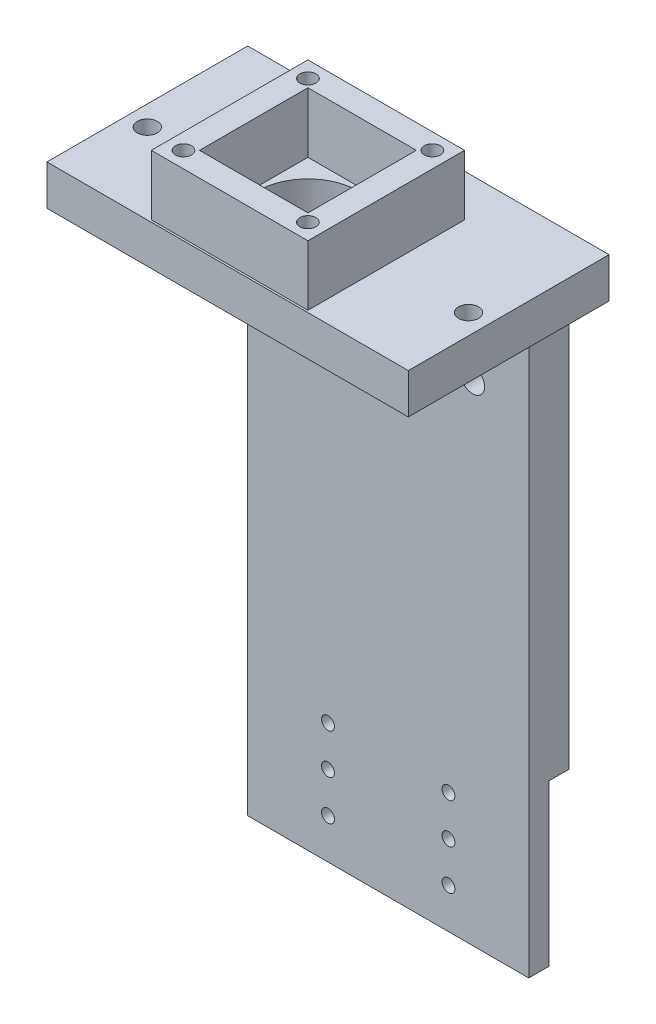
ISO-10303-21;
HEADER;
FILE_DESCRIPTION(('STEP AP214'),'2;1');
FILE_NAME('part.step','',(''),(''),'','','');
FILE_SCHEMA(('AUTOMOTIVE_DESIGN { 1 0 10303 214 1 1 1 1 }'));
ENDSEC;
DATA;
#1=APPLICATION_CONTEXT('core data for automotive mechanical design processes');
#2=APPLICATION_PROTOCOL_DEFINITION('international standard','automotive_design',2000,#1);
#3=PRODUCT_CONTEXT('',#1,'mechanical');
#4=PRODUCT('Part','Part','',(#3));
#5=PRODUCT_RELATED_PRODUCT_CATEGORY('part','',(#4));
#6=PRODUCT_DEFINITION_FORMATION('','',#4);
#7=PRODUCT_DEFINITION_CONTEXT('part definition',#1,'design');
#8=PRODUCT_DEFINITION('design','',#6,#7);
#9=PRODUCT_DEFINITION_SHAPE('','',#8);
#10=(LENGTH_UNIT() NAMED_UNIT(*) SI_UNIT(.MILLI.,.METRE.));
#11=(NAMED_UNIT(*) PLANE_ANGLE_UNIT() SI_UNIT($,.RADIAN.));
#12=(NAMED_UNIT(*) SI_UNIT($,.STERADIAN.) SOLID_ANGLE_UNIT());
#13=UNCERTAINTY_MEASURE_WITH_UNIT(LENGTH_MEASURE(1.E-05),#10,'distance_accuracy_value','');
#14=(GEOMETRIC_REPRESENTATION_CONTEXT(3) GLOBAL_UNCERTAINTY_ASSIGNED_CONTEXT((#13)) GLOBAL_UNIT_ASSIGNED_CONTEXT((#10,
#11,#12)) REPRESENTATION_CONTEXT('',''));
#15=CARTESIAN_POINT('',(0.,0.,0.));
#16=DIRECTION('',(0.,0.,1.));
#17=DIRECTION('',(1.,0.,0.));
#18=AXIS2_PLACEMENT_3D('',#15,#16,#17);
#19=CARTESIAN_POINT('',(47.8741031645975,130.,27.7151189199662));
#20=DIRECTION('',(0.,0.,1.));
#21=DIRECTION('',(0.,-1.,0.));
#22=AXIS2_PLACEMENT_3D('',#19,#20,#21);
#23=PLANE('',#22);
#24=CARTESIAN_POINT('',(17.8641031645975,110.,27.7151189199662));
#25=DIRECTION('',(0.,0.,1.));
#26=DIRECTION('',(0.,-1.,0.));
#27=AXIS2_PLACEMENT_3D('',#24,#25,#26);
#28=CIRCLE('',#27,1.60000000000001);
#29=CARTESIAN_POINT('',(17.8641031645975,108.4,27.7151189199662));
#30=VERTEX_POINT('',#29);
#31=EDGE_CURVE('E356',#30,#30,#28,.F.);
#32=ORIENTED_EDGE('',*,*,#31,.F.);
#33=EDGE_LOOP('',(#32));
#34=FACE_BOUND('',#33,.T.);
#35=CARTESIAN_POINT('',(-12.1358968354025,120.,27.7151189199662));
#36=DIRECTION('',(0.,0.,1.));
#37=DIRECTION('',(0.,-1.,0.));
#38=AXIS2_PLACEMENT_3D('',#35,#36,#37);
#39=CIRCLE('',#38,1.6);
#40=CARTESIAN_POINT('',(-12.1358968354025,118.4,27.7151189199662));
#41=VERTEX_POINT('',#40);
#42=EDGE_CURVE('E350',#41,#41,#39,.F.);
#43=ORIENTED_EDGE('',*,*,#42,.F.);
#44=EDGE_LOOP('',(#43));
#45=FACE_BOUND('',#44,.T.);
#46=CARTESIAN_POINT('',(-12.1358968354025,100.,27.7151189199662));
#47=DIRECTION('',(0.,0.,1.));
#48=DIRECTION('',(0.,-1.,0.));
#49=AXIS2_PLACEMENT_3D('',#46,#47,#48);
#50=CIRCLE('',#49,1.6);
#51=CARTESIAN_POINT('',(-12.1358968354025,98.4,27.7151189199662));
#52=VERTEX_POINT('',#51);
#53=EDGE_CURVE('E335',#52,#52,#50,.F.);
#54=ORIENTED_EDGE('',*,*,#53,.F.);
#55=EDGE_LOOP('',(#54));
#56=FACE_BOUND('',#55,.T.);
#57=CARTESIAN_POINT('',(-12.1358968354025,110.,27.7151189199662));
#58=DIRECTION('',(0.,0.,1.));
#59=DIRECTION('',(0.,-1.,0.));
#60=AXIS2_PLACEMENT_3D('',#57,#58,#59);
#61=CIRCLE('',#60,1.6);
#62=CARTESIAN_POINT('',(-12.1358968354025,108.4,27.7151189199662));
#63=VERTEX_POINT('',#62);
#64=EDGE_CURVE('E338',#63,#63,#61,.F.);
#65=ORIENTED_EDGE('',*,*,#64,.F.);
#66=EDGE_LOOP('',(#65));
#67=FACE_BOUND('',#66,.T.);
#68=CARTESIAN_POINT('',(17.8641031645975,120.,27.7151189199662));
#69=DIRECTION('',(0.,0.,1.));
#70=DIRECTION('',(0.,-1.,0.));
#71=AXIS2_PLACEMENT_3D('',#68,#69,#70);
#72=CIRCLE('',#71,1.60000000000001);
#73=CARTESIAN_POINT('',(17.8641031645975,118.4,27.7151189199662));
#74=VERTEX_POINT('',#73);
#75=EDGE_CURVE('E353',#74,#74,#72,.F.);
#76=ORIENTED_EDGE('',*,*,#75,.F.);
#77=EDGE_LOOP('',(#76));
#78=FACE_BOUND('',#77,.T.);
#79=CARTESIAN_POINT('',(17.8641031645975,100.,27.7151189199662));
#80=DIRECTION('',(0.,0.,1.));
#81=DIRECTION('',(0.,-1.,0.));
#82=AXIS2_PLACEMENT_3D('',#79,#80,#81);
#83=CIRCLE('',#82,1.60000000000001);
#84=CARTESIAN_POINT('',(17.8641031645975,98.4,27.7151189199662));
#85=VERTEX_POINT('',#84);
#86=EDGE_CURVE('E342',#85,#85,#83,.F.);
#87=ORIENTED_EDGE('',*,*,#86,.F.);
#88=EDGE_LOOP('',(#87));
#89=FACE_BOUND('',#88,.T.);
#90=DIRECTION('',(-1.,0.,0.));
#91=VECTOR('',#90,1.);
#92=CARTESIAN_POINT('',(47.8741031645975,130.,27.7151189199662));
#93=LINE('',#92,#91);
#94=CARTESIAN_POINT('',(37.8641031645975,130.,27.7151189199662));
#95=VERTEX_POINT('',#94);
#96=CARTESIAN_POINT('',(-32.1358968354025,130.,27.7151189199662));
#97=VERTEX_POINT('',#96);
#98=EDGE_CURVE('E47',#95,#97,#93,.T.);
#99=ORIENTED_EDGE('',*,*,#98,.F.);
#100=DIRECTION('',(0.,1.,0.));
#101=VECTOR('',#100,1.);
#102=CARTESIAN_POINT('',(37.8641031645975,236.,27.7151189199662));
#103=LINE('',#102,#101);
#104=CARTESIAN_POINT('',(37.8641031645975,90.,27.7151189199662));
#105=VERTEX_POINT('',#104);
#106=EDGE_CURVE('E54',#105,#95,#103,.T.);
#107=ORIENTED_EDGE('',*,*,#106,.F.);
#108=DIRECTION('',(-1.,0.,0.));
#109=VECTOR('',#108,1.);
#110=CARTESIAN_POINT('',(47.8741031645975,90.,27.7151189199662));
#111=LINE('',#110,#109);
#112=CARTESIAN_POINT('',(-32.1358968354025,90.,27.7151189199662));
#113=VERTEX_POINT('',#112);
#114=EDGE_CURVE('E11',#105,#113,#111,.T.);
#115=ORIENTED_EDGE('',*,*,#114,.T.);
#116=DIRECTION('',(0.,-1.,0.));
#117=VECTOR('',#116,1.);
#118=CARTESIAN_POINT('',(-32.1358968354025,236.,27.7151189199662));
#119=LINE('',#118,#117);
#120=EDGE_CURVE('E363',#97,#113,#119,.T.);
#121=ORIENTED_EDGE('',*,*,#120,.F.);
#122=EDGE_LOOP('',(#99,#107,#115,#121));
#123=FACE_BOUND('',#122,.T.);
#124=ADVANCED_FACE('F38',(#34,#45,#56,#67,#78,#89,#123),#23,.F.);
#125=CARTESIAN_POINT('',(47.8741031645975,90.,27.7151189199662));
#126=DIRECTION('',(0.,1.,0.));
#127=DIRECTION('',(0.,0.,1.));
#128=AXIS2_PLACEMENT_3D('',#125,#126,#127);
#129=PLANE('',#128);
#130=ORIENTED_EDGE('',*,*,#114,.F.);
#131=DIRECTION('',(0.,0.,-1.));
#132=VECTOR('',#131,1.);
#133=CARTESIAN_POINT('',(37.8641031645975,90.,32.7151189199662));
#134=LINE('',#133,#132);
#135=CARTESIAN_POINT('',(37.8641031645975,90.,32.7151189199662));
#136=VERTEX_POINT('',#135);
#137=EDGE_CURVE('E344',#136,#105,#134,.T.);
#138=ORIENTED_EDGE('',*,*,#137,.F.);
#139=DIRECTION('',(1.,0.,0.));
#140=VECTOR('',#139,1.);
#141=CARTESIAN_POINT('',(-32.1358968354025,90.,32.7151189199662));
#142=LINE('',#141,#140);
#143=CARTESIAN_POINT('',(-32.1358968354025,90.,32.7151189199662));
#144=VERTEX_POINT('',#143);
#145=EDGE_CURVE('E339',#144,#136,#142,.T.);
#146=ORIENTED_EDGE('',*,*,#145,.F.);
#147=DIRECTION('',(0.,0.,1.));
#148=VECTOR('',#147,1.);
#149=CARTESIAN_POINT('',(-32.1358968354025,90.,22.7151189199662));
#150=LINE('',#149,#148);
#151=EDGE_CURVE('E365',#113,#144,#150,.T.);
#152=ORIENTED_EDGE('',*,*,#151,.F.);
#153=EDGE_LOOP('',(#130,#138,#146,#152));
#154=FACE_BOUND('',#153,.T.);
#155=ADVANCED_FACE('F386',(#154),#129,.F.);
#156=CARTESIAN_POINT('',(47.8741031645975,130.,22.7151189199662));
#157=DIRECTION('',(0.,1.,0.));
#158=DIRECTION('',(0.,0.,1.));
#159=AXIS2_PLACEMENT_3D('',#156,#157,#158);
#160=PLANE('',#159);
#161=DIRECTION('',(-1.,0.,0.));
#162=VECTOR('',#161,1.);
#163=CARTESIAN_POINT('',(37.8641031645975,130.,22.7151189199662));
#164=LINE('',#163,#162);
#165=CARTESIAN_POINT('',(37.8641031645975,130.,22.7151189199662));
#166=VERTEX_POINT('',#165);
#167=CARTESIAN_POINT('',(-32.1358968354025,130.,22.7151189199662));
#168=VERTEX_POINT('',#167);
#169=EDGE_CURVE('E341',#166,#168,#164,.T.);
#170=ORIENTED_EDGE('',*,*,#169,.F.);
#171=DIRECTION('',(0.,0.,-1.));
#172=VECTOR('',#171,1.);
#173=CARTESIAN_POINT('',(37.8641031645975,130.,32.7151189199662));
#174=LINE('',#173,#172);
#175=EDGE_CURVE('E362',#95,#166,#174,.T.);
#176=ORIENTED_EDGE('',*,*,#175,.F.);
#177=ORIENTED_EDGE('',*,*,#98,.T.);
#178=DIRECTION('',(0.,0.,1.));
#179=VECTOR('',#178,1.);
#180=CARTESIAN_POINT('',(-32.1358968354025,130.,22.7151189199662));
#181=LINE('',#180,#179);
#182=EDGE_CURVE('E42',#168,#97,#181,.T.);
#183=ORIENTED_EDGE('',*,*,#182,.F.);
#184=EDGE_LOOP('',(#170,#176,#177,#183));
#185=FACE_BOUND('',#184,.T.);
#186=ADVANCED_FACE('F40',(#185),#160,.F.);
#187=CARTESIAN_POINT('',(16.3641031645975,261.,33.2151189199662));
#188=DIRECTION('',(-1.,0.,0.));
#189=DIRECTION('',(0.,0.,1.));
#190=AXIS2_PLACEMENT_3D('',#187,#188,#189);
#191=PLANE('',#190);
#192=DIRECTION('',(0.,0.,-1.));
#193=VECTOR('',#192,1.);
#194=CARTESIAN_POINT('',(16.3641031645975,246.,33.2151189199662));
#195=LINE('',#194,#193);
#196=CARTESIAN_POINT('',(16.3641031645975,246.,66.2151189199662));
#197=VERTEX_POINT('',#196);
#198=CARTESIAN_POINT('',(16.3641031645975,246.,39.2151189199662));
#199=VERTEX_POINT('',#198);
#200=EDGE_CURVE('E257',#197,#199,#195,.T.);
#201=ORIENTED_EDGE('',*,*,#200,.F.);
#202=DIRECTION('',(0.,-1.,0.));
#203=VECTOR('',#202,1.);
#204=CARTESIAN_POINT('',(16.3641031645975,261.,66.2151189199662));
#205=LINE('',#204,#203);
#206=CARTESIAN_POINT('',(16.3641031645975,261.,66.2151189199662));
#207=VERTEX_POINT('',#206);
#208=EDGE_CURVE('E265',#207,#197,#205,.T.);
#209=ORIENTED_EDGE('',*,*,#208,.F.);
#210=DIRECTION('',(0.,0.,-1.));
#211=VECTOR('',#210,1.);
#212=CARTESIAN_POINT('',(16.3641031645975,261.,33.2151189199662));
#213=LINE('',#212,#211);
#214=CARTESIAN_POINT('',(16.3641031645975,261.,39.2151189199662));
#215=VERTEX_POINT('',#214);
#216=EDGE_CURVE('E246',#207,#215,#213,.T.);
#217=ORIENTED_EDGE('',*,*,#216,.T.);
#218=DIRECTION('',(0.,-1.,0.));
#219=VECTOR('',#218,1.);
#220=CARTESIAN_POINT('',(16.3641031645975,261.,39.2151189199662));
#221=LINE('',#220,#219);
#222=EDGE_CURVE('E263',#215,#199,#221,.T.);
#223=ORIENTED_EDGE('',*,*,#222,.T.);
#224=EDGE_LOOP('',(#201,#209,#217,#223));
#225=FACE_BOUND('',#224,.T.);
#226=ADVANCED_FACE('F483',(#225),#191,.T.);
#227=CARTESIAN_POINT('',(-16.6358968354025,261.,39.2151189199662));
#228=DIRECTION('',(0.,0.,1.));
#229=DIRECTION('',(1.,0.,0.));
#230=AXIS2_PLACEMENT_3D('',#227,#228,#229);
#231=PLANE('',#230);
#232=DIRECTION('',(-1.,0.,0.));
#233=VECTOR('',#232,1.);
#234=CARTESIAN_POINT('',(-16.6358968354025,246.,39.2151189199662));
#235=LINE('',#234,#233);
#236=CARTESIAN_POINT('',(-10.6358968354025,246.,39.2151189199662));
#237=VERTEX_POINT('',#236);
#238=EDGE_CURVE('E244',#199,#237,#235,.T.);
#239=ORIENTED_EDGE('',*,*,#238,.F.);
#240=ORIENTED_EDGE('',*,*,#222,.F.);
#241=DIRECTION('',(-1.,0.,0.));
#242=VECTOR('',#241,1.);
#243=CARTESIAN_POINT('',(-16.6358968354025,261.,39.2151189199662));
#244=LINE('',#243,#242);
#245=CARTESIAN_POINT('',(-10.6358968354025,261.,39.2151189199662));
#246=VERTEX_POINT('',#245);
#247=EDGE_CURVE('E249',#215,#246,#244,.T.);
#248=ORIENTED_EDGE('',*,*,#247,.T.);
#249=DIRECTION('',(0.,-1.,0.));
#250=VECTOR('',#249,1.);
#251=CARTESIAN_POINT('',(-10.6358968354025,261.,39.2151189199662));
#252=LINE('',#251,#250);
#253=EDGE_CURVE('E251',#246,#237,#252,.T.);
#254=ORIENTED_EDGE('',*,*,#253,.T.);
#255=EDGE_LOOP('',(#239,#240,#248,#254));
#256=FACE_BOUND('',#255,.T.);
#257=ADVANCED_FACE('F472',(#256),#231,.T.);
#258=CARTESIAN_POINT('',(-10.6358968354025,261.,33.2151189199662));
#259=DIRECTION('',(1.,0.,0.));
#260=DIRECTION('',(0.,0.,-1.));
#261=AXIS2_PLACEMENT_3D('',#258,#259,#260);
#262=PLANE('',#261);
#263=DIRECTION('',(0.,0.,1.));
#264=VECTOR('',#263,1.);
#265=CARTESIAN_POINT('',(-10.6358968354025,246.,33.2151189199662));
#266=LINE('',#265,#264);
#267=CARTESIAN_POINT('',(-10.6358968354025,246.,66.2151189199662));
#268=VERTEX_POINT('',#267);
#269=EDGE_CURVE('E238',#237,#268,#266,.T.);
#270=ORIENTED_EDGE('',*,*,#269,.F.);
#271=ORIENTED_EDGE('',*,*,#253,.F.);
#272=DIRECTION('',(0.,0.,1.));
#273=VECTOR('',#272,1.);
#274=CARTESIAN_POINT('',(-10.6358968354025,261.,33.2151189199662));
#275=LINE('',#274,#273);
#276=CARTESIAN_POINT('',(-10.6358968354025,261.,66.2151189199662));
#277=VERTEX_POINT('',#276);
#278=EDGE_CURVE('E241',#246,#277,#275,.T.);
#279=ORIENTED_EDGE('',*,*,#278,.T.);
#280=DIRECTION('',(0.,-1.,0.));
#281=VECTOR('',#280,1.);
#282=CARTESIAN_POINT('',(-10.6358968354025,261.,66.2151189199662));
#283=LINE('',#282,#281);
#284=EDGE_CURVE('E267',#277,#268,#283,.T.);
#285=ORIENTED_EDGE('',*,*,#284,.T.);
#286=EDGE_LOOP('',(#270,#271,#279,#285));
#287=FACE_BOUND('',#286,.T.);
#288=ADVANCED_FACE('F463',(#287),#262,.T.);
#289=CARTESIAN_POINT('',(-16.6358968354025,261.,66.2151189199662));
#290=DIRECTION('',(0.,0.,-1.));
#291=DIRECTION('',(-1.,0.,0.));
#292=AXIS2_PLACEMENT_3D('',#289,#290,#291);
#293=PLANE('',#292);
#294=DIRECTION('',(1.,0.,0.));
#295=VECTOR('',#294,1.);
#296=CARTESIAN_POINT('',(-16.6358968354025,246.,66.2151189199662));
#297=LINE('',#296,#295);
#298=EDGE_CURVE('E254',#268,#197,#297,.T.);
#299=ORIENTED_EDGE('',*,*,#298,.F.);
#300=ORIENTED_EDGE('',*,*,#284,.F.);
#301=DIRECTION('',(1.,0.,0.));
#302=VECTOR('',#301,1.);
#303=CARTESIAN_POINT('',(-16.6358968354025,261.,66.2151189199662));
#304=LINE('',#303,#302);
#305=EDGE_CURVE('E243',#277,#207,#304,.T.);
#306=ORIENTED_EDGE('',*,*,#305,.T.);
#307=ORIENTED_EDGE('',*,*,#208,.T.);
#308=EDGE_LOOP('',(#299,#300,#306,#307));
#309=FACE_BOUND('',#308,.T.);
#310=ADVANCED_FACE('F454',(#309),#293,.T.);
#311=CARTESIAN_POINT('',(37.8641031645975,246.,72.7151189199662));
#312=DIRECTION('',(0.,1.,0.));
#313=DIRECTION('',(0.,0.,1.));
#314=AXIS2_PLACEMENT_3D('',#311,#312,#313);
#315=PLANE('',#314);
#316=CARTESIAN_POINT('',(2.86410316459754,246.,52.7151189199662));
#317=DIRECTION('',(0.,-1.,0.));
#318=DIRECTION('',(0.,0.,-1.));
#319=AXIS2_PLACEMENT_3D('',#316,#317,#318);
#320=CIRCLE('',#319,12.5);
#321=CARTESIAN_POINT('',(2.86410316459754,246.,40.2151189199662));
#322=VERTEX_POINT('',#321);
#323=EDGE_CURVE('E178',#322,#322,#320,.T.);
#324=ORIENTED_EDGE('',*,*,#323,.T.);
#325=EDGE_LOOP('',(#324));
#326=FACE_BOUND('',#325,.T.);
#327=ORIENTED_EDGE('',*,*,#238,.T.);
#328=ORIENTED_EDGE('',*,*,#269,.T.);
#329=ORIENTED_EDGE('',*,*,#298,.T.);
#330=ORIENTED_EDGE('',*,*,#200,.T.);
#331=EDGE_LOOP('',(#327,#328,#329,#330));
#332=FACE_BOUND('',#331,.T.);
#333=ADVANCED_FACE('F442',(#326,#332),#315,.T.);
#334=CARTESIAN_POINT('',(0.,261.,0.));
#335=DIRECTION('',(0.,1.,0.));
#336=DIRECTION('',(0.,0.,1.));
#337=AXIS2_PLACEMENT_3D('',#334,#335,#336);
#338=PLANE('',#337);
#339=CARTESIAN_POINT('',(18.3641031645975,261.,37.2151189199662));
#340=DIRECTION('',(0.,1.,0.));
#341=DIRECTION('',(0.,0.,-1.));
#342=AXIS2_PLACEMENT_3D('',#339,#340,#341);
#343=CIRCLE('',#342,2.);
#344=CARTESIAN_POINT('',(18.3641031645975,261.,35.2151189199662));
#345=VERTEX_POINT('',#344);
#346=EDGE_CURVE('E223',#345,#345,#343,.T.);
#347=ORIENTED_EDGE('',*,*,#346,.F.);
#348=EDGE_LOOP('',(#347));
#349=FACE_BOUND('',#348,.T.);
#350=CARTESIAN_POINT('',(-12.6358968354025,261.,68.2151189199662));
#351=DIRECTION('',(0.,1.,0.));
#352=DIRECTION('',(0.,0.,-1.));
#353=AXIS2_PLACEMENT_3D('',#350,#351,#352);
#354=CIRCLE('',#353,2.);
#355=CARTESIAN_POINT('',(-12.6358968354025,261.,66.2151189199662));
#356=VERTEX_POINT('',#355);
#357=EDGE_CURVE('E230',#356,#356,#354,.T.);
#358=ORIENTED_EDGE('',*,*,#357,.F.);
#359=EDGE_LOOP('',(#358));
#360=FACE_BOUND('',#359,.T.);
#361=CARTESIAN_POINT('',(18.3641031645975,261.,68.2151189199662));
#362=DIRECTION('',(0.,1.,0.));
#363=DIRECTION('',(0.,0.,1.));
#364=AXIS2_PLACEMENT_3D('',#361,#362,#363);
#365=CIRCLE('',#364,2.);
#366=CARTESIAN_POINT('',(18.3641031645975,261.,70.2151189199662));
#367=VERTEX_POINT('',#366);
#368=EDGE_CURVE('E217',#367,#367,#365,.T.);
#369=ORIENTED_EDGE('',*,*,#368,.F.);
#370=EDGE_LOOP('',(#369));
#371=FACE_BOUND('',#370,.T.);
#372=CARTESIAN_POINT('',(-12.6358968354025,261.,37.2151189199662));
#373=DIRECTION('',(0.,1.,0.));
#374=DIRECTION('',(0.,0.,1.));
#375=AXIS2_PLACEMENT_3D('',#372,#373,#374);
#376=CIRCLE('',#375,2.);
#377=CARTESIAN_POINT('',(-12.6358968354025,261.,39.2151189199662));
#378=VERTEX_POINT('',#377);
#379=EDGE_CURVE('E226',#378,#378,#376,.T.);
#380=ORIENTED_EDGE('',*,*,#379,.F.);
#381=EDGE_LOOP('',(#380));
#382=FACE_BOUND('',#381,.T.);
#383=DIRECTION('',(0.,0.,1.));
#384=VECTOR('',#383,1.);
#385=CARTESIAN_POINT('',(-16.6358968354025,261.,33.2151189199662));
#386=LINE('',#385,#384);
#387=CARTESIAN_POINT('',(-16.6358968354025,261.,33.2151189199662));
#388=VERTEX_POINT('',#387);
#389=CARTESIAN_POINT('',(-16.6358968354025,261.,72.2151189199662));
#390=VERTEX_POINT('',#389);
#391=EDGE_CURVE('E271',#388,#390,#386,.T.);
#392=ORIENTED_EDGE('',*,*,#391,.T.);
#393=DIRECTION('',(1.,0.,0.));
#394=VECTOR('',#393,1.);
#395=CARTESIAN_POINT('',(-16.6358968354025,261.,72.2151189199662));
#396=LINE('',#395,#394);
#397=CARTESIAN_POINT('',(22.3641031645975,261.,72.2151189199662));
#398=VERTEX_POINT('',#397);
#399=EDGE_CURVE('E274',#390,#398,#396,.T.);
#400=ORIENTED_EDGE('',*,*,#399,.T.);
#401=DIRECTION('',(0.,0.,-1.));
#402=VECTOR('',#401,1.);
#403=CARTESIAN_POINT('',(22.3641031645975,261.,33.2151189199662));
#404=LINE('',#403,#402);
#405=CARTESIAN_POINT('',(22.3641031645975,261.,33.2151189199662));
#406=VERTEX_POINT('',#405);
#407=EDGE_CURVE('E277',#398,#406,#404,.T.);
#408=ORIENTED_EDGE('',*,*,#407,.T.);
#409=DIRECTION('',(-1.,0.,0.));
#410=VECTOR('',#409,1.);
#411=CARTESIAN_POINT('',(-16.6358968354025,261.,33.2151189199662));
#412=LINE('',#411,#410);
#413=EDGE_CURVE('E279',#406,#388,#412,.T.);
#414=ORIENTED_EDGE('',*,*,#413,.T.);
#415=EDGE_LOOP('',(#392,#400,#408,#414));
#416=FACE_BOUND('',#415,.T.);
#417=ORIENTED_EDGE('',*,*,#305,.F.);
#418=ORIENTED_EDGE('',*,*,#278,.F.);
#419=ORIENTED_EDGE('',*,*,#247,.F.);
#420=ORIENTED_EDGE('',*,*,#216,.F.);
#421=EDGE_LOOP('',(#417,#418,#419,#420));
#422=FACE_BOUND('',#421,.T.);
#423=ADVANCED_FACE('F453',(#349,#360,#371,#382,#416,#422),#338,.T.);
#424=CARTESIAN_POINT('',(-16.6358968354025,261.,72.2151189199662));
#425=DIRECTION('',(0.,0.,-1.));
#426=DIRECTION('',(-1.,0.,0.));
#427=AXIS2_PLACEMENT_3D('',#424,#425,#426);
#428=PLANE('',#427);
#429=DIRECTION('',(1.,0.,0.));
#430=VECTOR('',#429,1.);
#431=CARTESIAN_POINT('',(-16.6358968354025,246.,72.2151189199662));
#432=LINE('',#431,#430);
#433=CARTESIAN_POINT('',(-16.6358968354025,246.,72.2151189199662));
#434=VERTEX_POINT('',#433);
#435=CARTESIAN_POINT('',(22.3641031645975,246.,72.2151189199662));
#436=VERTEX_POINT('',#435);
#437=EDGE_CURVE('E284',#434,#436,#432,.T.);
#438=ORIENTED_EDGE('',*,*,#437,.T.);
#439=DIRECTION('',(0.,-1.,0.));
#440=VECTOR('',#439,1.);
#441=CARTESIAN_POINT('',(22.3641031645975,261.,72.2151189199662));
#442=LINE('',#441,#440);
#443=EDGE_CURVE('E297',#398,#436,#442,.T.);
#444=ORIENTED_EDGE('',*,*,#443,.F.);
#445=ORIENTED_EDGE('',*,*,#399,.F.);
#446=DIRECTION('',(0.,-1.,0.));
#447=VECTOR('',#446,1.);
#448=CARTESIAN_POINT('',(-16.6358968354025,261.,72.2151189199662));
#449=LINE('',#448,#447);
#450=EDGE_CURVE('E300',#390,#434,#449,.T.);
#451=ORIENTED_EDGE('',*,*,#450,.T.);
#452=EDGE_LOOP('',(#438,#444,#445,#451));
#453=FACE_BOUND('',#452,.T.);
#454=ADVANCED_FACE('F460',(#453),#428,.F.);
#455=CARTESIAN_POINT('',(22.3641031645975,261.,33.2151189199662));
#456=DIRECTION('',(-1.,0.,0.));
#457=DIRECTION('',(0.,0.,1.));
#458=AXIS2_PLACEMENT_3D('',#455,#456,#457);
#459=PLANE('',#458);
#460=DIRECTION('',(0.,0.,-1.));
#461=VECTOR('',#460,1.);
#462=CARTESIAN_POINT('',(22.3641031645975,246.,33.2151189199662));
#463=LINE('',#462,#461);
#464=CARTESIAN_POINT('',(22.3641031645975,246.,33.2151189199662));
#465=VERTEX_POINT('',#464);
#466=EDGE_CURVE('E287',#436,#465,#463,.T.);
#467=ORIENTED_EDGE('',*,*,#466,.T.);
#468=DIRECTION('',(0.,-1.,0.));
#469=VECTOR('',#468,1.);
#470=CARTESIAN_POINT('',(22.3641031645975,261.,33.2151189199662));
#471=LINE('',#470,#469);
#472=EDGE_CURVE('E294',#406,#465,#471,.T.);
#473=ORIENTED_EDGE('',*,*,#472,.F.);
#474=ORIENTED_EDGE('',*,*,#407,.F.);
#475=ORIENTED_EDGE('',*,*,#443,.T.);
#476=EDGE_LOOP('',(#467,#473,#474,#475));
#477=FACE_BOUND('',#476,.T.);
#478=ADVANCED_FACE('F497',(#477),#459,.F.);
#479=CARTESIAN_POINT('',(-16.6358968354025,261.,33.2151189199662));
#480=DIRECTION('',(0.,0.,1.));
#481=DIRECTION('',(1.,0.,0.));
#482=AXIS2_PLACEMENT_3D('',#479,#480,#481);
#483=PLANE('',#482);
#484=DIRECTION('',(-1.,0.,0.));
#485=VECTOR('',#484,1.);
#486=CARTESIAN_POINT('',(-16.6358968354025,246.,33.2151189199662));
#487=LINE('',#486,#485);
#488=CARTESIAN_POINT('',(-16.6358968354025,246.,33.2151189199662));
#489=VERTEX_POINT('',#488);
#490=EDGE_CURVE('E275',#465,#489,#487,.T.);
#491=ORIENTED_EDGE('',*,*,#490,.T.);
#492=DIRECTION('',(0.,-1.,0.));
#493=VECTOR('',#492,1.);
#494=CARTESIAN_POINT('',(-16.6358968354025,261.,33.2151189199662));
#495=LINE('',#494,#493);
#496=EDGE_CURVE('E281',#388,#489,#495,.T.);
#497=ORIENTED_EDGE('',*,*,#496,.F.);
#498=ORIENTED_EDGE('',*,*,#413,.F.);
#499=ORIENTED_EDGE('',*,*,#472,.T.);
#500=EDGE_LOOP('',(#491,#497,#498,#499));
#501=FACE_BOUND('',#500,.T.);
#502=ADVANCED_FACE('F406',(#501),#483,.F.);
#503=CARTESIAN_POINT('',(-16.6358968354025,261.,33.2151189199662));
#504=DIRECTION('',(1.,0.,0.));
#505=DIRECTION('',(0.,0.,-1.));
#506=AXIS2_PLACEMENT_3D('',#503,#504,#505);
#507=PLANE('',#506);
#508=DIRECTION('',(0.,0.,1.));
#509=VECTOR('',#508,1.);
#510=CARTESIAN_POINT('',(-16.6358968354025,246.,33.2151189199662));
#511=LINE('',#510,#509);
#512=EDGE_CURVE('E270',#489,#434,#511,.T.);
#513=ORIENTED_EDGE('',*,*,#512,.T.);
#514=ORIENTED_EDGE('',*,*,#450,.F.);
#515=ORIENTED_EDGE('',*,*,#391,.F.);
#516=ORIENTED_EDGE('',*,*,#496,.T.);
#517=EDGE_LOOP('',(#513,#514,#515,#516));
#518=FACE_BOUND('',#517,.T.);
#519=ADVANCED_FACE('F397',(#518),#507,.F.);
#520=CARTESIAN_POINT('',(0.,0.,72.7151189199662));
#521=DIRECTION('',(0.,0.,1.));
#522=DIRECTION('',(1.,0.,0.));
#523=AXIS2_PLACEMENT_3D('',#520,#521,#522);
#524=PLANE('',#523);
#525=DIRECTION('',(-1.,0.,0.));
#526=VECTOR('',#525,1.);
#527=CARTESIAN_POINT('',(-32.1358968354025,236.,72.7151189199662));
#528=LINE('',#527,#526);
#529=CARTESIAN_POINT('',(47.8641031645975,236.,72.7151189199662));
#530=VERTEX_POINT('',#529);
#531=CARTESIAN_POINT('',(-42.1358968354025,236.,72.7151189199662));
#532=VERTEX_POINT('',#531);
#533=EDGE_CURVE('E177',#530,#532,#528,.T.);
#534=ORIENTED_EDGE('',*,*,#533,.F.);
#535=DIRECTION('',(0.,1.,0.));
#536=VECTOR('',#535,1.);
#537=CARTESIAN_POINT('',(47.8641031645975,246.,72.7151189199662));
#538=LINE('',#537,#536);
#539=CARTESIAN_POINT('',(47.8641031645975,246.,72.7151189199662));
#540=VERTEX_POINT('',#539);
#541=EDGE_CURVE('E192',#530,#540,#538,.T.);
#542=ORIENTED_EDGE('',*,*,#541,.T.);
#543=DIRECTION('',(1.,0.,0.));
#544=VECTOR('',#543,1.);
#545=CARTESIAN_POINT('',(37.8641031645975,246.,72.7151189199662));
#546=LINE('',#545,#544);
#547=CARTESIAN_POINT('',(-42.1358968354025,246.,72.7151189199662));
#548=VERTEX_POINT('',#547);
#549=EDGE_CURVE('E191',#548,#540,#546,.T.);
#550=ORIENTED_EDGE('',*,*,#549,.F.);
#551=DIRECTION('',(0.,1.,0.));
#552=VECTOR('',#551,1.);
#553=CARTESIAN_POINT('',(-42.1358968354025,246.,72.7151189199662));
#554=LINE('',#553,#552);
#555=EDGE_CURVE('E208',#532,#548,#554,.T.);
#556=ORIENTED_EDGE('',*,*,#555,.F.);
#557=EDGE_LOOP('',(#534,#542,#550,#556));
#558=FACE_BOUND('',#557,.T.);
#559=ADVANCED_FACE('F394',(#558),#524,.T.);
#560=CARTESIAN_POINT('',(2.86410316459754,246.,52.7151189199662));
#561=DIRECTION('',(0.,-1.,0.));
#562=DIRECTION('',(0.,0.,-1.));
#563=AXIS2_PLACEMENT_3D('',#560,#561,#562);
#564=CYLINDRICAL_SURFACE('',#563,12.5);
#565=ORIENTED_EDGE('',*,*,#323,.F.);
#566=EDGE_LOOP('',(#565));
#567=FACE_BOUND('',#566,.T.);
#568=CARTESIAN_POINT('',(2.86410316459754,236.,52.7151189199662));
#569=DIRECTION('',(0.,-1.,0.));
#570=DIRECTION('',(0.,0.,-1.));
#571=AXIS2_PLACEMENT_3D('',#568,#569,#570);
#572=CIRCLE('',#571,12.5);
#573=CARTESIAN_POINT('',(2.86410316459754,236.,40.2151189199662));
#574=VERTEX_POINT('',#573);
#575=EDGE_CURVE('E303',#574,#574,#572,.T.);
#576=ORIENTED_EDGE('',*,*,#575,.T.);
#577=EDGE_LOOP('',(#576));
#578=FACE_BOUND('',#577,.T.);
#579=ADVANCED_FACE('F396',(#567,#578),#564,.F.);
#580=CARTESIAN_POINT('',(-12.6358968354025,236.,37.2151189199662));
#581=DIRECTION('',(0.,1.,0.));
#582=DIRECTION('',(0.,0.,1.));
#583=AXIS2_PLACEMENT_3D('',#580,#581,#582);
#584=CYLINDRICAL_SURFACE('',#583,2.);
#585=CARTESIAN_POINT('',(-12.6358968354025,236.,37.2151189199662));
#586=DIRECTION('',(0.,1.,0.));
#587=DIRECTION('',(0.,0.,1.));
#588=AXIS2_PLACEMENT_3D('',#585,#586,#587);
#589=CIRCLE('',#588,2.);
#590=CARTESIAN_POINT('',(-12.6358968354025,236.,39.2151189199662));
#591=VERTEX_POINT('',#590);
#592=EDGE_CURVE('E235',#591,#591,#589,.T.);
#593=ORIENTED_EDGE('',*,*,#592,.F.);
#594=EDGE_LOOP('',(#593));
#595=FACE_BOUND('',#594,.T.);
#596=ORIENTED_EDGE('',*,*,#379,.T.);
#597=EDGE_LOOP('',(#596));
#598=FACE_BOUND('',#597,.T.);
#599=ADVANCED_FACE('F403',(#595,#598),#584,.F.);
#600=CARTESIAN_POINT('',(18.3641031645975,236.,68.2151189199662));
#601=DIRECTION('',(0.,1.,0.));
#602=DIRECTION('',(0.,0.,1.));
#603=AXIS2_PLACEMENT_3D('',#600,#601,#602);
#604=CYLINDRICAL_SURFACE('',#603,2.);
#605=CARTESIAN_POINT('',(18.3641031645975,236.,68.2151189199662));
#606=DIRECTION('',(0.,1.,0.));
#607=DIRECTION('',(0.,0.,1.));
#608=AXIS2_PLACEMENT_3D('',#605,#606,#607);
#609=CIRCLE('',#608,2.);
#610=CARTESIAN_POINT('',(18.3641031645975,236.,70.2151189199662));
#611=VERTEX_POINT('',#610);
#612=EDGE_CURVE('E216',#611,#611,#609,.T.);
#613=ORIENTED_EDGE('',*,*,#612,.F.);
#614=EDGE_LOOP('',(#613));
#615=FACE_BOUND('',#614,.T.);
#616=ORIENTED_EDGE('',*,*,#368,.T.);
#617=EDGE_LOOP('',(#616));
#618=FACE_BOUND('',#617,.T.);
#619=ADVANCED_FACE('F562',(#615,#618),#604,.F.);
#620=CARTESIAN_POINT('',(-12.6358968354025,236.,68.2151189199662));
#621=DIRECTION('',(0.,1.,0.));
#622=DIRECTION('',(0.,0.,1.));
#623=AXIS2_PLACEMENT_3D('',#620,#621,#622);
#624=CYLINDRICAL_SURFACE('',#623,2.);
#625=CARTESIAN_POINT('',(-12.6358968354025,236.,68.2151189199662));
#626=DIRECTION('',(0.,1.,0.));
#627=DIRECTION('',(0.,0.,-1.));
#628=AXIS2_PLACEMENT_3D('',#625,#626,#627);
#629=CIRCLE('',#628,2.);
#630=CARTESIAN_POINT('',(-12.6358968354025,236.,66.2151189199662));
#631=VERTEX_POINT('',#630);
#632=EDGE_CURVE('E220',#631,#631,#629,.T.);
#633=ORIENTED_EDGE('',*,*,#632,.F.);
#634=EDGE_LOOP('',(#633));
#635=FACE_BOUND('',#634,.T.);
#636=ORIENTED_EDGE('',*,*,#357,.T.);
#637=EDGE_LOOP('',(#636));
#638=FACE_BOUND('',#637,.T.);
#639=ADVANCED_FACE('F573',(#635,#638),#624,.F.);
#640=CARTESIAN_POINT('',(18.3641031645975,236.,37.2151189199662));
#641=DIRECTION('',(0.,1.,0.));
#642=DIRECTION('',(0.,0.,1.));
#643=AXIS2_PLACEMENT_3D('',#640,#641,#642);
#644=CYLINDRICAL_SURFACE('',#643,2.);
#645=CARTESIAN_POINT('',(18.3641031645975,236.,37.2151189199662));
#646=DIRECTION('',(0.,1.,0.));
#647=DIRECTION('',(0.,0.,-1.));
#648=AXIS2_PLACEMENT_3D('',#645,#646,#647);
#649=CIRCLE('',#648,2.);
#650=CARTESIAN_POINT('',(18.3641031645975,236.,35.2151189199662));
#651=VERTEX_POINT('',#650);
#652=EDGE_CURVE('E227',#651,#651,#649,.T.);
#653=ORIENTED_EDGE('',*,*,#652,.F.);
#654=EDGE_LOOP('',(#653));
#655=FACE_BOUND('',#654,.T.);
#656=ORIENTED_EDGE('',*,*,#346,.T.);
#657=EDGE_LOOP('',(#656));
#658=FACE_BOUND('',#657,.T.);
#659=ADVANCED_FACE('F585',(#655,#658),#644,.F.);
#660=CARTESIAN_POINT('',(42.8641031645975,261.,52.7151189199662));
#661=DIRECTION('',(0.,-1.,0.));
#662=DIRECTION('',(0.,0.,-1.));
#663=AXIS2_PLACEMENT_3D('',#660,#661,#662);
#664=CYLINDRICAL_SURFACE('',#663,2.5);
#665=CARTESIAN_POINT('',(42.8641031645975,236.,52.7151189199662));
#666=DIRECTION('',(0.,-1.,0.));
#667=DIRECTION('',(0.,0.,-1.));
#668=AXIS2_PLACEMENT_3D('',#665,#666,#667);
#669=CIRCLE('',#668,2.5);
#670=CARTESIAN_POINT('',(42.8641031645975,236.,50.2151189199662));
#671=VERTEX_POINT('',#670);
#672=EDGE_CURVE('E900',#671,#671,#669,.T.);
#673=ORIENTED_EDGE('',*,*,#672,.T.);
#674=EDGE_LOOP('',(#673));
#675=FACE_BOUND('',#674,.T.);
#676=CARTESIAN_POINT('',(42.8641031645975,246.,52.7151189199662));
#677=DIRECTION('',(0.,1.,0.));
#678=DIRECTION('',(0.,0.,1.));
#679=AXIS2_PLACEMENT_3D('',#676,#677,#678);
#680=CIRCLE('',#679,2.5);
#681=CARTESIAN_POINT('',(42.8641031645975,246.,55.2151189199662));
#682=VERTEX_POINT('',#681);
#683=EDGE_CURVE('E896',#682,#682,#680,.T.);
#684=ORIENTED_EDGE('',*,*,#683,.T.);
#685=EDGE_LOOP('',(#684));
#686=FACE_BOUND('',#685,.T.);
#687=ADVANCED_FACE('F595',(#675,#686),#664,.F.);
#688=CARTESIAN_POINT('',(-37.1358968354025,261.,52.7151189199662));
#689=DIRECTION('',(0.,-1.,0.));
#690=DIRECTION('',(0.,0.,-1.));
#691=AXIS2_PLACEMENT_3D('',#688,#689,#690);
#692=CYLINDRICAL_SURFACE('',#691,2.5);
#693=CARTESIAN_POINT('',(-37.1358968354025,236.,52.7151189199662));
#694=DIRECTION('',(0.,-1.,0.));
#695=DIRECTION('',(0.,0.,-1.));
#696=AXIS2_PLACEMENT_3D('',#693,#694,#695);
#697=CIRCLE('',#696,2.5);
#698=CARTESIAN_POINT('',(-37.1358968354025,236.,50.2151189199662));
#699=VERTEX_POINT('',#698);
#700=EDGE_CURVE('E201',#699,#699,#697,.T.);
#701=ORIENTED_EDGE('',*,*,#700,.T.);
#702=EDGE_LOOP('',(#701));
#703=FACE_BOUND('',#702,.T.);
#704=CARTESIAN_POINT('',(-37.1358968354025,246.,52.7151189199662));
#705=DIRECTION('',(0.,1.,0.));
#706=DIRECTION('',(0.,0.,1.));
#707=AXIS2_PLACEMENT_3D('',#704,#705,#706);
#708=CIRCLE('',#707,2.5);
#709=CARTESIAN_POINT('',(-37.1358968354025,246.,55.2151189199662));
#710=VERTEX_POINT('',#709);
#711=EDGE_CURVE('E911',#710,#710,#708,.T.);
#712=ORIENTED_EDGE('',*,*,#711,.T.);
#713=EDGE_LOOP('',(#712));
#714=FACE_BOUND('',#713,.T.);
#715=ADVANCED_FACE('F448',(#703,#714),#692,.F.);
#716=CARTESIAN_POINT('',(47.8641031645976,0.,0.));
#717=DIRECTION('',(-1.,0.,0.));
#718=DIRECTION('',(0.,0.,-1.));
#719=AXIS2_PLACEMENT_3D('',#716,#717,#718);
#720=PLANE('',#719);
#721=DIRECTION('',(0.,-1.,0.));
#722=VECTOR('',#721,1.);
#723=CARTESIAN_POINT('',(47.8641031645975,236.,22.7151189199662));
#724=LINE('',#723,#722);
#725=CARTESIAN_POINT('',(47.8641031645975,246.,22.7151189199662));
#726=VERTEX_POINT('',#725);
#727=CARTESIAN_POINT('',(47.8641031645975,236.,22.7151189199662));
#728=VERTEX_POINT('',#727);
#729=EDGE_CURVE('E168',#726,#728,#724,.T.);
#730=ORIENTED_EDGE('',*,*,#729,.F.);
#731=DIRECTION('',(0.,0.,-1.));
#732=VECTOR('',#731,1.);
#733=CARTESIAN_POINT('',(47.8641031645975,246.,22.7151189199662));
#734=LINE('',#733,#732);
#735=EDGE_CURVE('E184',#540,#726,#734,.T.);
#736=ORIENTED_EDGE('',*,*,#735,.F.);
#737=ORIENTED_EDGE('',*,*,#541,.F.);
#738=DIRECTION('',(0.,0.,1.));
#739=VECTOR('',#738,1.);
#740=CARTESIAN_POINT('',(47.8641031645975,236.,72.7151189199662));
#741=LINE('',#740,#739);
#742=EDGE_CURVE('E187',#728,#530,#741,.T.);
#743=ORIENTED_EDGE('',*,*,#742,.F.);
#744=EDGE_LOOP('',(#730,#736,#737,#743));
#745=FACE_BOUND('',#744,.T.);
#746=ADVANCED_FACE('F182',(#745),#720,.F.);
#747=ORIENTED_EDGE('',*,*,#711,.F.);
#748=EDGE_LOOP('',(#747));
#749=FACE_BOUND('',#748,.T.);
#750=ORIENTED_EDGE('',*,*,#683,.F.);
#751=EDGE_LOOP('',(#750));
#752=FACE_BOUND('',#751,.T.);
#753=ORIENTED_EDGE('',*,*,#512,.F.);
#754=ORIENTED_EDGE('',*,*,#490,.F.);
#755=ORIENTED_EDGE('',*,*,#466,.F.);
#756=ORIENTED_EDGE('',*,*,#437,.F.);
#757=EDGE_LOOP('',(#753,#754,#755,#756));
#758=FACE_BOUND('',#757,.T.);
#759=DIRECTION('',(1.,0.,0.));
#760=VECTOR('',#759,1.);
#761=CARTESIAN_POINT('',(37.8641031645975,246.,22.7151189199662));
#762=LINE('',#761,#760);
#763=CARTESIAN_POINT('',(-42.1358968354025,246.,22.7151189199662));
#764=VERTEX_POINT('',#763);
#765=EDGE_CURVE('E162',#764,#726,#762,.T.);
#766=ORIENTED_EDGE('',*,*,#765,.F.);
#767=DIRECTION('',(0.,0.,-1.));
#768=VECTOR('',#767,1.);
#769=CARTESIAN_POINT('',(-42.1358968354025,246.,22.7151189199662));
#770=LINE('',#769,#768);
#771=EDGE_CURVE('E211',#548,#764,#770,.T.);
#772=ORIENTED_EDGE('',*,*,#771,.F.);
#773=ORIENTED_EDGE('',*,*,#549,.T.);
#774=ORIENTED_EDGE('',*,*,#735,.T.);
#775=EDGE_LOOP('',(#766,#772,#773,#774));
#776=FACE_BOUND('',#775,.T.);
#777=ADVANCED_FACE('F190',(#749,#752,#758,#776),#315,.T.);
#778=CARTESIAN_POINT('',(-42.1358968354025,0.,0.));
#779=DIRECTION('',(1.,0.,0.));
#780=DIRECTION('',(0.,0.,-1.));
#781=AXIS2_PLACEMENT_3D('',#778,#779,#780);
#782=PLANE('',#781);
#783=DIRECTION('',(0.,-1.,0.));
#784=VECTOR('',#783,1.);
#785=CARTESIAN_POINT('',(-42.1358968354025,236.,22.7151189199662));
#786=LINE('',#785,#784);
#787=CARTESIAN_POINT('',(-42.1358968354025,236.,22.7151189199662));
#788=VERTEX_POINT('',#787);
#789=EDGE_CURVE('E172',#764,#788,#786,.T.);
#790=ORIENTED_EDGE('',*,*,#789,.T.);
#791=DIRECTION('',(0.,0.,1.));
#792=VECTOR('',#791,1.);
#793=CARTESIAN_POINT('',(-42.1358968354025,236.,72.7151189199662));
#794=LINE('',#793,#792);
#795=EDGE_CURVE('E205',#788,#532,#794,.T.);
#796=ORIENTED_EDGE('',*,*,#795,.T.);
#797=ORIENTED_EDGE('',*,*,#555,.T.);
#798=ORIENTED_EDGE('',*,*,#771,.T.);
#799=EDGE_LOOP('',(#790,#796,#797,#798));
#800=FACE_BOUND('',#799,.T.);
#801=ADVANCED_FACE('F392',(#800),#782,.F.);
#802=CARTESIAN_POINT('',(-32.1358968354025,236.,72.7151189199662));
#803=DIRECTION('',(0.,-1.,0.));
#804=DIRECTION('',(0.,0.,-1.));
#805=AXIS2_PLACEMENT_3D('',#802,#803,#804);
#806=PLANE('',#805);
#807=ORIENTED_EDGE('',*,*,#700,.F.);
#808=EDGE_LOOP('',(#807));
#809=FACE_BOUND('',#808,.T.);
#810=ORIENTED_EDGE('',*,*,#672,.F.);
#811=EDGE_LOOP('',(#810));
#812=FACE_BOUND('',#811,.T.);
#813=ORIENTED_EDGE('',*,*,#652,.T.);
#814=EDGE_LOOP('',(#813));
#815=FACE_BOUND('',#814,.T.);
#816=ORIENTED_EDGE('',*,*,#632,.T.);
#817=EDGE_LOOP('',(#816));
#818=FACE_BOUND('',#817,.T.);
#819=ORIENTED_EDGE('',*,*,#612,.T.);
#820=EDGE_LOOP('',(#819));
#821=FACE_BOUND('',#820,.T.);
#822=ORIENTED_EDGE('',*,*,#592,.T.);
#823=EDGE_LOOP('',(#822));
#824=FACE_BOUND('',#823,.T.);
#825=ORIENTED_EDGE('',*,*,#575,.F.);
#826=EDGE_LOOP('',(#825));
#827=FACE_BOUND('',#826,.T.);
#828=ORIENTED_EDGE('',*,*,#533,.T.);
#829=ORIENTED_EDGE('',*,*,#795,.F.);
#830=DIRECTION('',(1.,0.,0.));
#831=VECTOR('',#830,1.);
#832=CARTESIAN_POINT('',(-42.1358968354025,236.,22.7151189199662));
#833=LINE('',#832,#831);
#834=CARTESIAN_POINT('',(-32.1358968354025,236.,22.7151189199662));
#835=VERTEX_POINT('',#834);
#836=EDGE_CURVE('E213',#788,#835,#833,.T.);
#837=ORIENTED_EDGE('',*,*,#836,.T.);
#838=DIRECTION('',(0.,0.,1.));
#839=VECTOR('',#838,1.);
#840=CARTESIAN_POINT('',(-32.1358968354025,236.,72.7151189199662));
#841=LINE('',#840,#839);
#842=CARTESIAN_POINT('',(-32.1358968354025,236.,32.7151189199662));
#843=VERTEX_POINT('',#842);
#844=EDGE_CURVE('E203',#835,#843,#841,.T.);
#845=ORIENTED_EDGE('',*,*,#844,.T.);
#846=DIRECTION('',(1.,0.,0.));
#847=VECTOR('',#846,1.);
#848=CARTESIAN_POINT('',(-32.1358968354025,236.,32.7151189199662));
#849=LINE('',#848,#847);
#850=CARTESIAN_POINT('',(37.8641031645975,236.,32.7151189199662));
#851=VERTEX_POINT('',#850);
#852=EDGE_CURVE('E314',#843,#851,#849,.T.);
#853=ORIENTED_EDGE('',*,*,#852,.T.);
#854=DIRECTION('',(0.,0.,1.));
#855=VECTOR('',#854,1.);
#856=CARTESIAN_POINT('',(37.8641031645975,236.,72.7151189199662));
#857=LINE('',#856,#855);
#858=CARTESIAN_POINT('',(37.8641031645975,236.,22.7151189199662));
#859=VERTEX_POINT('',#858);
#860=EDGE_CURVE('E188',#859,#851,#857,.T.);
#861=ORIENTED_EDGE('',*,*,#860,.F.);
#862=DIRECTION('',(-1.,0.,0.));
#863=VECTOR('',#862,1.);
#864=CARTESIAN_POINT('',(47.8641031645975,236.,22.7151189199662));
#865=LINE('',#864,#863);
#866=EDGE_CURVE('E198',#728,#859,#865,.T.);
#867=ORIENTED_EDGE('',*,*,#866,.F.);
#868=ORIENTED_EDGE('',*,*,#742,.T.);
#869=EDGE_LOOP('',(#828,#829,#837,#845,#853,#861,#867,#868));
#870=FACE_BOUND('',#869,.T.);
#871=ADVANCED_FACE('F375',(#809,#812,#815,#818,#821,#824,#827,#870),#806,.T.);
#872=CARTESIAN_POINT('',(37.8641031645975,236.,32.7151189199662));
#873=DIRECTION('',(-1.,0.,0.));
#874=DIRECTION('',(0.,0.,1.));
#875=AXIS2_PLACEMENT_3D('',#872,#873,#874);
#876=PLANE('',#875);
#877=ORIENTED_EDGE('',*,*,#106,.T.);
#878=ORIENTED_EDGE('',*,*,#175,.T.);
#879=DIRECTION('',(0.,-1.,0.));
#880=VECTOR('',#879,1.);
#881=CARTESIAN_POINT('',(37.8641031645975,236.,22.7151189199662));
#882=LINE('',#881,#880);
#883=EDGE_CURVE('E333',#859,#166,#882,.T.);
#884=ORIENTED_EDGE('',*,*,#883,.F.);
#885=ORIENTED_EDGE('',*,*,#860,.T.);
#886=DIRECTION('',(0.,-1.,0.));
#887=VECTOR('',#886,1.);
#888=CARTESIAN_POINT('',(37.8641031645975,236.,32.7151189199662));
#889=LINE('',#888,#887);
#890=EDGE_CURVE('E324',#851,#136,#889,.T.);
#891=ORIENTED_EDGE('',*,*,#890,.T.);
#892=ORIENTED_EDGE('',*,*,#137,.T.);
#893=EDGE_LOOP('',(#877,#878,#884,#885,#891,#892));
#894=FACE_BOUND('',#893,.T.);
#895=ADVANCED_FACE('F369',(#894),#876,.F.);
#896=CARTESIAN_POINT('',(-32.1358968354025,236.,22.7151189199662));
#897=DIRECTION('',(1.,0.,0.));
#898=DIRECTION('',(0.,0.,-1.));
#899=AXIS2_PLACEMENT_3D('',#896,#897,#898);
#900=PLANE('',#899);
#901=DIRECTION('',(0.,-1.,0.));
#902=VECTOR('',#901,1.);
#903=CARTESIAN_POINT('',(-32.1358968354025,236.,22.7151189199662));
#904=LINE('',#903,#902);
#905=EDGE_CURVE('E330',#835,#168,#904,.T.);
#906=ORIENTED_EDGE('',*,*,#905,.T.);
#907=ORIENTED_EDGE('',*,*,#182,.T.);
#908=ORIENTED_EDGE('',*,*,#120,.T.);
#909=ORIENTED_EDGE('',*,*,#151,.T.);
#910=DIRECTION('',(0.,-1.,0.));
#911=VECTOR('',#910,1.);
#912=CARTESIAN_POINT('',(-32.1358968354025,236.,32.7151189199662));
#913=LINE('',#912,#911);
#914=EDGE_CURVE('E327',#843,#144,#913,.T.);
#915=ORIENTED_EDGE('',*,*,#914,.F.);
#916=ORIENTED_EDGE('',*,*,#844,.F.);
#917=EDGE_LOOP('',(#906,#907,#908,#909,#915,#916));
#918=FACE_BOUND('',#917,.T.);
#919=ADVANCED_FACE('F388',(#918),#900,.F.);
#920=CARTESIAN_POINT('',(23.8641031645975,212.,22.7151189199662));
#921=DIRECTION('',(0.,0.,1.));
#922=DIRECTION('',(1.,0.,0.));
#923=AXIS2_PLACEMENT_3D('',#920,#921,#922);
#924=CYLINDRICAL_SURFACE('',#923,3.);
#925=CARTESIAN_POINT('',(23.8641031645975,212.,22.7151189199662));
#926=DIRECTION('',(0.,0.,1.));
#927=DIRECTION('',(-1.,0.,0.));
#928=AXIS2_PLACEMENT_3D('',#925,#926,#927);
#929=CIRCLE('',#928,3.);
#930=CARTESIAN_POINT('',(20.8641031645975,212.,22.7151189199662));
#931=VERTEX_POINT('',#930);
#932=EDGE_CURVE('E309',#931,#931,#929,.T.);
#933=ORIENTED_EDGE('',*,*,#932,.F.);
#934=EDGE_LOOP('',(#933));
#935=FACE_BOUND('',#934,.T.);
#936=CARTESIAN_POINT('',(23.8641031645975,212.,32.7151189199662));
#937=DIRECTION('',(0.,0.,1.));
#938=DIRECTION('',(-1.,0.,0.));
#939=AXIS2_PLACEMENT_3D('',#936,#937,#938);
#940=CIRCLE('',#939,3.);
#941=CARTESIAN_POINT('',(20.8641031645975,212.,32.7151189199662));
#942=VERTEX_POINT('',#941);
#943=EDGE_CURVE('E318',#942,#942,#940,.T.);
#944=ORIENTED_EDGE('',*,*,#943,.T.);
#945=EDGE_LOOP('',(#944));
#946=FACE_BOUND('',#945,.T.);
#947=ADVANCED_FACE('F426',(#935,#946),#924,.F.);
#948=CARTESIAN_POINT('',(-18.1358968354025,212.,22.7151189199662));
#949=DIRECTION('',(0.,0.,1.));
#950=DIRECTION('',(1.,0.,0.));
#951=AXIS2_PLACEMENT_3D('',#948,#949,#950);
#952=CYLINDRICAL_SURFACE('',#951,3.);
#953=CARTESIAN_POINT('',(-18.1358968354025,212.,22.7151189199662));
#954=DIRECTION('',(0.,0.,1.));
#955=DIRECTION('',(1.,0.,0.));
#956=AXIS2_PLACEMENT_3D('',#953,#954,#955);
#957=CIRCLE('',#956,3.);
#958=CARTESIAN_POINT('',(-15.1358968354025,212.,22.7151189199662));
#959=VERTEX_POINT('',#958);
#960=EDGE_CURVE('E311',#959,#959,#957,.T.);
#961=ORIENTED_EDGE('',*,*,#960,.F.);
#962=EDGE_LOOP('',(#961));
#963=FACE_BOUND('',#962,.T.);
#964=CARTESIAN_POINT('',(-18.1358968354025,212.,32.7151189199662));
#965=DIRECTION('',(0.,0.,1.));
#966=DIRECTION('',(1.,0.,0.));
#967=AXIS2_PLACEMENT_3D('',#964,#965,#966);
#968=CIRCLE('',#967,3.);
#969=CARTESIAN_POINT('',(-15.1358968354025,212.,32.7151189199662));
#970=VERTEX_POINT('',#969);
#971=EDGE_CURVE('E315',#970,#970,#968,.T.);
#972=ORIENTED_EDGE('',*,*,#971,.T.);
#973=EDGE_LOOP('',(#972));
#974=FACE_BOUND('',#973,.T.);
#975=ADVANCED_FACE('F430',(#963,#974),#952,.F.);
#976=CARTESIAN_POINT('',(-32.1358968354025,236.,32.7151189199662));
#977=DIRECTION('',(0.,0.,-1.));
#978=DIRECTION('',(-1.,0.,0.));
#979=AXIS2_PLACEMENT_3D('',#976,#977,#978);
#980=PLANE('',#979);
#981=CARTESIAN_POINT('',(-12.1358968354025,100.,32.7151189199662));
#982=DIRECTION('',(0.,0.,-1.));
#983=DIRECTION('',(-1.,0.,0.));
#984=AXIS2_PLACEMENT_3D('',#981,#982,#983);
#985=CIRCLE('',#984,1.6);
#986=CARTESIAN_POINT('',(-13.7358968354025,100.,32.7151189199662));
#987=VERTEX_POINT('',#986);
#988=EDGE_CURVE('E906',#987,#987,#985,.T.);
#989=ORIENTED_EDGE('',*,*,#988,.T.);
#990=EDGE_LOOP('',(#989));
#991=FACE_BOUND('',#990,.T.);
#992=CARTESIAN_POINT('',(-12.1358968354025,110.,32.7151189199662));
#993=DIRECTION('',(0.,0.,-1.));
#994=DIRECTION('',(-1.,0.,0.));
#995=AXIS2_PLACEMENT_3D('',#992,#993,#994);
#996=CIRCLE('',#995,1.6);
#997=CARTESIAN_POINT('',(-13.7358968354025,110.,32.7151189199662));
#998=VERTEX_POINT('',#997);
#999=EDGE_CURVE('E943',#998,#998,#996,.T.);
#1000=ORIENTED_EDGE('',*,*,#999,.T.);
#1001=EDGE_LOOP('',(#1000));
#1002=FACE_BOUND('',#1001,.T.);
#1003=CARTESIAN_POINT('',(-12.1358968354025,120.,32.7151189199662));
#1004=DIRECTION('',(0.,0.,-1.));
#1005=DIRECTION('',(-1.,0.,0.));
#1006=AXIS2_PLACEMENT_3D('',#1003,#1004,#1005);
#1007=CIRCLE('',#1006,1.6);
#1008=CARTESIAN_POINT('',(-13.7358968354025,120.,32.7151189199662));
#1009=VERTEX_POINT('',#1008);
#1010=EDGE_CURVE('E946',#1009,#1009,#1007,.T.);
#1011=ORIENTED_EDGE('',*,*,#1010,.T.);
#1012=EDGE_LOOP('',(#1011));
#1013=FACE_BOUND('',#1012,.T.);
#1014=CARTESIAN_POINT('',(17.8641031645975,120.,32.7151189199662));
#1015=DIRECTION('',(0.,0.,-1.));
#1016=DIRECTION('',(-1.,0.,0.));
#1017=AXIS2_PLACEMENT_3D('',#1014,#1015,#1016);
#1018=CIRCLE('',#1017,1.60000000000001);
#1019=CARTESIAN_POINT('',(16.2641031645975,120.,32.7151189199662));
#1020=VERTEX_POINT('',#1019);
#1021=EDGE_CURVE('E903',#1020,#1020,#1018,.T.);
#1022=ORIENTED_EDGE('',*,*,#1021,.T.);
#1023=EDGE_LOOP('',(#1022));
#1024=FACE_BOUND('',#1023,.T.);
#1025=CARTESIAN_POINT('',(17.8641031645975,110.,32.7151189199662));
#1026=DIRECTION('',(0.,0.,-1.));
#1027=DIRECTION('',(-1.,0.,0.));
#1028=AXIS2_PLACEMENT_3D('',#1025,#1026,#1027);
#1029=CIRCLE('',#1028,1.60000000000001);
#1030=CARTESIAN_POINT('',(16.2641031645975,110.,32.7151189199662));
#1031=VERTEX_POINT('',#1030);
#1032=EDGE_CURVE('E897',#1031,#1031,#1029,.T.);
#1033=ORIENTED_EDGE('',*,*,#1032,.T.);
#1034=EDGE_LOOP('',(#1033));
#1035=FACE_BOUND('',#1034,.T.);
#1036=CARTESIAN_POINT('',(17.8641031645975,100.,32.7151189199662));
#1037=DIRECTION('',(0.,0.,-1.));
#1038=DIRECTION('',(-1.,0.,0.));
#1039=AXIS2_PLACEMENT_3D('',#1036,#1037,#1038);
#1040=CIRCLE('',#1039,1.60000000000001);
#1041=CARTESIAN_POINT('',(16.2641031645975,100.,32.7151189199662));
#1042=VERTEX_POINT('',#1041);
#1043=EDGE_CURVE('E894',#1042,#1042,#1040,.T.);
#1044=ORIENTED_EDGE('',*,*,#1043,.T.);
#1045=EDGE_LOOP('',(#1044));
#1046=FACE_BOUND('',#1045,.T.);
#1047=ORIENTED_EDGE('',*,*,#971,.F.);
#1048=EDGE_LOOP('',(#1047));
#1049=FACE_BOUND('',#1048,.T.);
#1050=ORIENTED_EDGE('',*,*,#943,.F.);
#1051=EDGE_LOOP('',(#1050));
#1052=FACE_BOUND('',#1051,.T.);
#1053=ORIENTED_EDGE('',*,*,#914,.T.);
#1054=ORIENTED_EDGE('',*,*,#145,.T.);
#1055=ORIENTED_EDGE('',*,*,#890,.F.);
#1056=ORIENTED_EDGE('',*,*,#852,.F.);
#1057=EDGE_LOOP('',(#1053,#1054,#1055,#1056));
#1058=FACE_BOUND('',#1057,.T.);
#1059=ADVANCED_FACE('F381',(#991,#1002,#1013,#1024,#1035,#1046,#1049,#1052,#1058),#980,.F.);
#1060=CARTESIAN_POINT('',(-12.1358968354025,100.,32.7151189199662));
#1061=DIRECTION('',(0.,0.,-1.));
#1062=DIRECTION('',(-1.,0.,0.));
#1063=AXIS2_PLACEMENT_3D('',#1060,#1061,#1062);
#1064=CYLINDRICAL_SURFACE('',#1063,1.6);
#1065=ORIENTED_EDGE('',*,*,#53,.T.);
#1066=EDGE_LOOP('',(#1065));
#1067=FACE_BOUND('',#1066,.T.);
#1068=ORIENTED_EDGE('',*,*,#988,.F.);
#1069=EDGE_LOOP('',(#1068));
#1070=FACE_BOUND('',#1069,.T.);
#1071=ADVANCED_FACE('F429',(#1067,#1070),#1064,.F.);
#1072=CARTESIAN_POINT('',(-12.1358968354025,110.,32.7151189199662));
#1073=DIRECTION('',(0.,0.,-1.));
#1074=DIRECTION('',(-1.,0.,0.));
#1075=AXIS2_PLACEMENT_3D('',#1072,#1073,#1074);
#1076=CYLINDRICAL_SURFACE('',#1075,1.6);
#1077=ORIENTED_EDGE('',*,*,#64,.T.);
#1078=EDGE_LOOP('',(#1077));
#1079=FACE_BOUND('',#1078,.T.);
#1080=ORIENTED_EDGE('',*,*,#999,.F.);
#1081=EDGE_LOOP('',(#1080));
#1082=FACE_BOUND('',#1081,.T.);
#1083=ADVANCED_FACE('F714',(#1079,#1082),#1076,.F.);
#1084=CARTESIAN_POINT('',(-12.1358968354025,120.,32.7151189199662));
#1085=DIRECTION('',(0.,0.,-1.));
#1086=DIRECTION('',(-1.,0.,0.));
#1087=AXIS2_PLACEMENT_3D('',#1084,#1085,#1086);
#1088=CYLINDRICAL_SURFACE('',#1087,1.6);
#1089=ORIENTED_EDGE('',*,*,#42,.T.);
#1090=EDGE_LOOP('',(#1089));
#1091=FACE_BOUND('',#1090,.T.);
#1092=ORIENTED_EDGE('',*,*,#1010,.F.);
#1093=EDGE_LOOP('',(#1092));
#1094=FACE_BOUND('',#1093,.T.);
#1095=ADVANCED_FACE('F724',(#1091,#1094),#1088,.F.);
#1096=CARTESIAN_POINT('',(17.8641031645975,120.,32.7151189199662));
#1097=DIRECTION('',(0.,0.,-1.));
#1098=DIRECTION('',(-1.,0.,0.));
#1099=AXIS2_PLACEMENT_3D('',#1096,#1097,#1098);
#1100=CYLINDRICAL_SURFACE('',#1099,1.60000000000001);
#1101=ORIENTED_EDGE('',*,*,#75,.T.);
#1102=EDGE_LOOP('',(#1101));
#1103=FACE_BOUND('',#1102,.T.);
#1104=ORIENTED_EDGE('',*,*,#1021,.F.);
#1105=EDGE_LOOP('',(#1104));
#1106=FACE_BOUND('',#1105,.T.);
#1107=ADVANCED_FACE('F735',(#1103,#1106),#1100,.F.);
#1108=CARTESIAN_POINT('',(17.8641031645975,110.,32.7151189199662));
#1109=DIRECTION('',(0.,0.,-1.));
#1110=DIRECTION('',(-1.,0.,0.));
#1111=AXIS2_PLACEMENT_3D('',#1108,#1109,#1110);
#1112=CYLINDRICAL_SURFACE('',#1111,1.60000000000001);
#1113=ORIENTED_EDGE('',*,*,#31,.T.);
#1114=EDGE_LOOP('',(#1113));
#1115=FACE_BOUND('',#1114,.T.);
#1116=ORIENTED_EDGE('',*,*,#1032,.F.);
#1117=EDGE_LOOP('',(#1116));
#1118=FACE_BOUND('',#1117,.T.);
#1119=ADVANCED_FACE('F746',(#1115,#1118),#1112,.F.);
#1120=CARTESIAN_POINT('',(17.8641031645975,100.,32.7151189199662));
#1121=DIRECTION('',(0.,0.,-1.));
#1122=DIRECTION('',(-1.,0.,0.));
#1123=AXIS2_PLACEMENT_3D('',#1120,#1121,#1122);
#1124=CYLINDRICAL_SURFACE('',#1123,1.60000000000001);
#1125=ORIENTED_EDGE('',*,*,#86,.T.);
#1126=EDGE_LOOP('',(#1125));
#1127=FACE_BOUND('',#1126,.T.);
#1128=ORIENTED_EDGE('',*,*,#1043,.F.);
#1129=EDGE_LOOP('',(#1128));
#1130=FACE_BOUND('',#1129,.T.);
#1131=ADVANCED_FACE('F423',(#1127,#1130),#1124,.F.);
#1132=CARTESIAN_POINT('',(37.8641031645975,236.,22.7151189199662));
#1133=DIRECTION('',(0.,0.,1.));
#1134=DIRECTION('',(1.,0.,0.));
#1135=AXIS2_PLACEMENT_3D('',#1132,#1133,#1134);
#1136=PLANE('',#1135);
#1137=ORIENTED_EDGE('',*,*,#883,.T.);
#1138=ORIENTED_EDGE('',*,*,#169,.T.);
#1139=ORIENTED_EDGE('',*,*,#905,.F.);
#1140=ORIENTED_EDGE('',*,*,#836,.F.);
#1141=ORIENTED_EDGE('',*,*,#789,.F.);
#1142=ORIENTED_EDGE('',*,*,#765,.T.);
#1143=ORIENTED_EDGE('',*,*,#729,.T.);
#1144=ORIENTED_EDGE('',*,*,#866,.T.);
#1145=EDGE_LOOP('',(#1137,#1138,#1139,#1140,#1141,#1142,#1143,#1144));
#1146=FACE_BOUND('',#1145,.T.);
#1147=ORIENTED_EDGE('',*,*,#960,.T.);
#1148=EDGE_LOOP('',(#1147));
#1149=FACE_BOUND('',#1148,.T.);
#1150=ORIENTED_EDGE('',*,*,#932,.T.);
#1151=EDGE_LOOP('',(#1150));
#1152=FACE_BOUND('',#1151,.T.);
#1153=ADVANCED_FACE('F165',(#1146,#1149,#1152),#1136,.F.);
#1154=CLOSED_SHELL('',(#124,#155,#186,#226,#257,#288,#310,#333,#423,#454,#478,#502,#519,#559,
#579,#599,#619,#639,#659,#687,#715,#746,#777,#801,#871,#895,#919,#947,#975,#1059,#1071,#1083,
#1095,#1107,#1119,#1131,#1153));
#1155=MANIFOLD_SOLID_BREP('B2',#1154);
#1156=ADVANCED_BREP_SHAPE_REPRESENTATION('',(#18,#1155),#14);
#1157=SHAPE_DEFINITION_REPRESENTATION(#9,#1156);
ENDSEC;
END-ISO-10303-21;
